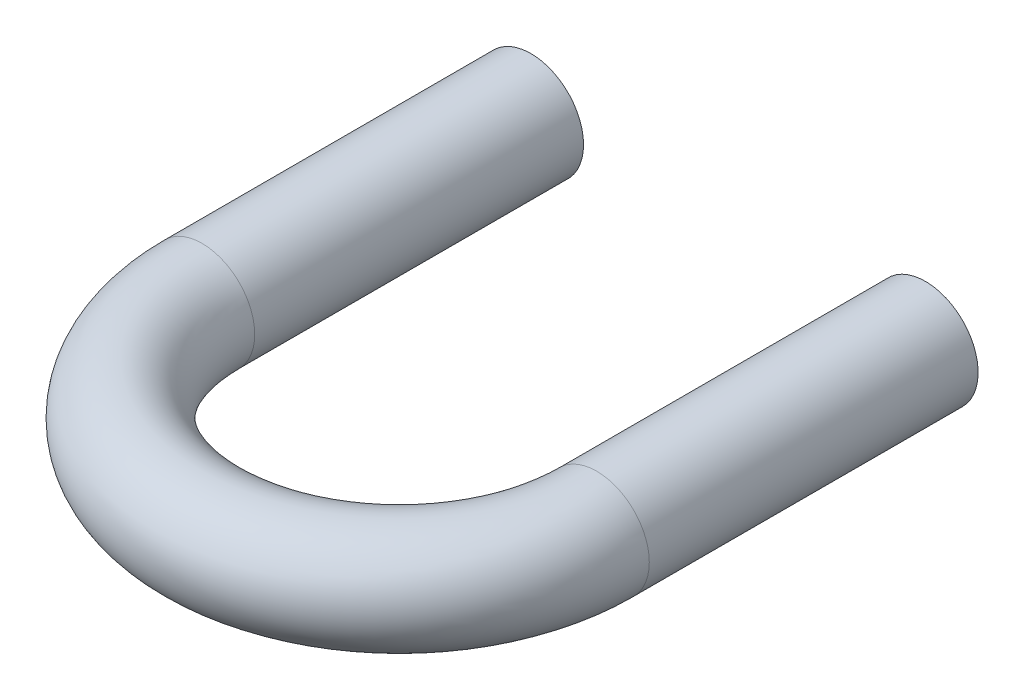
ISO-10303-21;
HEADER;
FILE_DESCRIPTION(('STEP AP214'),'2;1');
FILE_NAME('part.step','',(''),(''),'','','');
FILE_SCHEMA(('AUTOMOTIVE_DESIGN { 1 0 10303 214 1 1 1 1 }'));
ENDSEC;
DATA;
#1=APPLICATION_CONTEXT('core data for automotive mechanical design processes');
#2=APPLICATION_PROTOCOL_DEFINITION('international standard','automotive_design',2000,#1);
#3=PRODUCT_CONTEXT('',#1,'mechanical');
#4=PRODUCT('Part','Part','',(#3));
#5=PRODUCT_RELATED_PRODUCT_CATEGORY('part','',(#4));
#6=PRODUCT_DEFINITION_FORMATION('','',#4);
#7=PRODUCT_DEFINITION_CONTEXT('part definition',#1,'design');
#8=PRODUCT_DEFINITION('design','',#6,#7);
#9=PRODUCT_DEFINITION_SHAPE('','',#8);
#10=(LENGTH_UNIT() NAMED_UNIT(*) SI_UNIT(.MILLI.,.METRE.));
#11=(NAMED_UNIT(*) PLANE_ANGLE_UNIT() SI_UNIT($,.RADIAN.));
#12=(NAMED_UNIT(*) SI_UNIT($,.STERADIAN.) SOLID_ANGLE_UNIT());
#13=UNCERTAINTY_MEASURE_WITH_UNIT(LENGTH_MEASURE(1.E-05),#10,'distance_accuracy_value','');
#14=(GEOMETRIC_REPRESENTATION_CONTEXT(3) GLOBAL_UNCERTAINTY_ASSIGNED_CONTEXT((#13)) GLOBAL_UNIT_ASSIGNED_CONTEXT((#10,
#11,#12)) REPRESENTATION_CONTEXT('',''));
#15=CARTESIAN_POINT('',(0.,0.,0.));
#16=DIRECTION('',(0.,0.,1.));
#17=DIRECTION('',(1.,0.,0.));
#18=AXIS2_PLACEMENT_3D('',#15,#16,#17);
#19=CARTESIAN_POINT('',(-15.,0.,0.));
#20=DIRECTION('',(0.,0.,1.));
#21=DIRECTION('',(1.,0.,0.));
#22=AXIS2_PLACEMENT_3D('',#19,#20,#21);
#23=PLANE('',#22);
#24=CARTESIAN_POINT('',(-15.,0.,0.));
#25=DIRECTION('',(0.,0.,1.));
#26=DIRECTION('',(1.,0.,0.));
#27=AXIS2_PLACEMENT_3D('',#24,#25,#26);
#28=CIRCLE('',#27,4.);
#29=CARTESIAN_POINT('',(-11.,0.,0.));
#30=VERTEX_POINT('',#29);
#31=EDGE_CURVE('E54',#30,#30,#28,.T.);
#32=ORIENTED_EDGE('',*,*,#31,.F.);
#33=EDGE_LOOP('',(#32));
#34=FACE_BOUND('',#33,.T.);
#35=ADVANCED_FACE('F37',(#34),#23,.F.);
#36=CARTESIAN_POINT('',(15.,0.,0.));
#37=DIRECTION('',(0.,0.,-1.));
#38=DIRECTION('',(-1.,0.,0.));
#39=AXIS2_PLACEMENT_3D('',#36,#37,#38);
#40=PLANE('',#39);
#41=CARTESIAN_POINT('',(15.,0.,0.));
#42=DIRECTION('',(0.,0.,-1.));
#43=DIRECTION('',(-1.,0.,0.));
#44=AXIS2_PLACEMENT_3D('',#41,#42,#43);
#45=CIRCLE('',#44,4.);
#46=CARTESIAN_POINT('',(11.,0.,0.));
#47=VERTEX_POINT('',#46);
#48=EDGE_CURVE('E10',#47,#47,#45,.T.);
#49=ORIENTED_EDGE('',*,*,#48,.T.);
#50=EDGE_LOOP('',(#49));
#51=FACE_BOUND('',#50,.T.);
#52=ADVANCED_FACE('F64',(#51),#40,.T.);
#53=CARTESIAN_POINT('',(-15.,0.,0.));
#54=DIRECTION('',(0.,0.,1.));
#55=DIRECTION('',(1.,0.,0.));
#56=AXIS2_PLACEMENT_3D('',#53,#54,#55);
#57=CYLINDRICAL_SURFACE('',#56,4.);
#58=CARTESIAN_POINT('',(-15.,0.,25.));
#59=DIRECTION('',(0.,0.,1.));
#60=DIRECTION('',(1.,0.,0.));
#61=AXIS2_PLACEMENT_3D('',#58,#59,#60);
#62=CIRCLE('',#61,4.);
#63=CARTESIAN_POINT('',(-19.,0.,25.));
#64=VERTEX_POINT('',#63);
#65=EDGE_CURVE('E49',#64,#64,#62,.T.);
#66=ORIENTED_EDGE('',*,*,#65,.F.);
#67=EDGE_LOOP('',(#66));
#68=FACE_BOUND('',#67,.T.);
#69=ORIENTED_EDGE('',*,*,#31,.T.);
#70=EDGE_LOOP('',(#69));
#71=FACE_BOUND('',#70,.T.);
#72=ADVANCED_FACE('F61',(#68,#71),#57,.T.);
#73=CARTESIAN_POINT('',(0.,0.,25.));
#74=DIRECTION('',(0.,1.,0.));
#75=DIRECTION('',(0.,0.,1.));
#76=AXIS2_PLACEMENT_3D('',#73,#74,#75);
#77=TOROIDAL_SURFACE('',#76,15.,4.);
#78=CARTESIAN_POINT('',(15.,0.,25.));
#79=DIRECTION('',(0.,0.,-1.));
#80=DIRECTION('',(-1.,0.,0.));
#81=AXIS2_PLACEMENT_3D('',#78,#79,#80);
#82=CIRCLE('',#81,4.);
#83=CARTESIAN_POINT('',(19.,0.,25.));
#84=VERTEX_POINT('',#83);
#85=EDGE_CURVE('E44',#84,#84,#82,.T.);
#86=CARTESIAN_POINT('',(0.,0.,25.));
#87=DIRECTION('',(0.,1.,0.));
#88=DIRECTION('',(0.,0.,1.));
#89=AXIS2_PLACEMENT_3D('',#86,#87,#88);
#90=CIRCLE('',#89,19.);
#91=EDGE_CURVE('',#64,#84,#90,.T.);
#92=ORIENTED_EDGE('',*,*,#65,.T.);
#93=ORIENTED_EDGE('',*,*,#85,.F.);
#94=ORIENTED_EDGE('',*,*,#91,.T.);
#95=ORIENTED_EDGE('',*,*,#91,.F.);
#96=EDGE_LOOP('',(#92,#94,#93,#95));
#97=FACE_BOUND('',#96,.T.);
#98=ADVANCED_FACE('F70',(#97),#77,.T.);
#99=CARTESIAN_POINT('',(15.,0.,25.));
#100=DIRECTION('',(0.,0.,-1.));
#101=DIRECTION('',(-1.,0.,0.));
#102=AXIS2_PLACEMENT_3D('',#99,#100,#101);
#103=CYLINDRICAL_SURFACE('',#102,4.);
#104=ORIENTED_EDGE('',*,*,#48,.F.);
#105=EDGE_LOOP('',(#104));
#106=FACE_BOUND('',#105,.T.);
#107=ORIENTED_EDGE('',*,*,#85,.T.);
#108=EDGE_LOOP('',(#107));
#109=FACE_BOUND('',#108,.T.);
#110=ADVANCED_FACE('F68',(#106,#109),#103,.T.);
#111=CLOSED_SHELL('',(#35,#52,#72,#98,#110));
#112=MANIFOLD_SOLID_BREP('B2',#111);
#113=ADVANCED_BREP_SHAPE_REPRESENTATION('',(#18,#112),#14);
#114=SHAPE_DEFINITION_REPRESENTATION(#9,#113);
ENDSEC;
END-ISO-10303-21;
